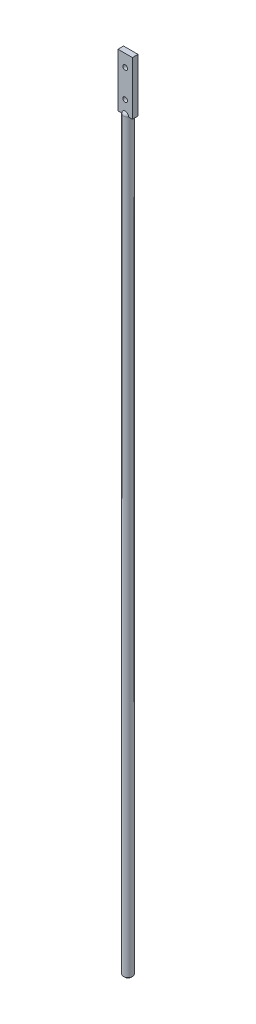
ISO-10303-21;
HEADER;
FILE_DESCRIPTION(('STEP AP214'),'2;1');
FILE_NAME('part.step','',(''),(''),'','','');
FILE_SCHEMA(('AUTOMOTIVE_DESIGN { 1 0 10303 214 1 1 1 1 }'));
ENDSEC;
DATA;
#1=APPLICATION_CONTEXT('core data for automotive mechanical design processes');
#2=APPLICATION_PROTOCOL_DEFINITION('international standard','automotive_design',2000,#1);
#3=PRODUCT_CONTEXT('',#1,'mechanical');
#4=PRODUCT('Part','Part','',(#3));
#5=PRODUCT_RELATED_PRODUCT_CATEGORY('part','',(#4));
#6=PRODUCT_DEFINITION_FORMATION('','',#4);
#7=PRODUCT_DEFINITION_CONTEXT('part definition',#1,'design');
#8=PRODUCT_DEFINITION('design','',#6,#7);
#9=PRODUCT_DEFINITION_SHAPE('','',#8);
#10=(LENGTH_UNIT() NAMED_UNIT(*) SI_UNIT(.MILLI.,.METRE.));
#11=(NAMED_UNIT(*) PLANE_ANGLE_UNIT() SI_UNIT($,.RADIAN.));
#12=(NAMED_UNIT(*) SI_UNIT($,.STERADIAN.) SOLID_ANGLE_UNIT());
#13=UNCERTAINTY_MEASURE_WITH_UNIT(LENGTH_MEASURE(1.E-05),#10,'distance_accuracy_value','');
#14=(GEOMETRIC_REPRESENTATION_CONTEXT(3) GLOBAL_UNCERTAINTY_ASSIGNED_CONTEXT((#13)) GLOBAL_UNIT_ASSIGNED_CONTEXT((#10,
#11,#12)) REPRESENTATION_CONTEXT('',''));
#15=CARTESIAN_POINT('',(0.,0.,0.));
#16=DIRECTION('',(0.,0.,1.));
#17=DIRECTION('',(1.,0.,0.));
#18=AXIS2_PLACEMENT_3D('',#15,#16,#17);
#19=CARTESIAN_POINT('',(0.,13.,-2.5));
#20=DIRECTION('',(0.,0.,-1.));
#21=DIRECTION('',(1.,0.,0.));
#22=AXIS2_PLACEMENT_3D('',#19,#20,#21);
#23=CYLINDRICAL_SURFACE('',#22,2.1);
#24=CARTESIAN_POINT('',(0.,13.,2.5));
#25=DIRECTION('',(0.,0.,1.));
#26=DIRECTION('',(1.,0.,0.));
#27=AXIS2_PLACEMENT_3D('',#24,#25,#26);
#28=CIRCLE('',#27,2.1);
#29=CARTESIAN_POINT('',(2.1,13.,2.5));
#30=VERTEX_POINT('',#29);
#31=EDGE_CURVE('E44',#30,#30,#28,.F.);
#32=ORIENTED_EDGE('',*,*,#31,.F.);
#33=EDGE_LOOP('',(#32));
#34=FACE_BOUND('',#33,.T.);
#35=CARTESIAN_POINT('',(0.,13.,-2.5));
#36=DIRECTION('',(0.,0.,1.));
#37=DIRECTION('',(1.,0.,0.));
#38=AXIS2_PLACEMENT_3D('',#35,#36,#37);
#39=CIRCLE('',#38,2.1);
#40=CARTESIAN_POINT('',(2.1,13.,-2.5));
#41=VERTEX_POINT('',#40);
#42=EDGE_CURVE('E165',#41,#41,#39,.F.);
#43=ORIENTED_EDGE('',*,*,#42,.T.);
#44=EDGE_LOOP('',(#43));
#45=FACE_BOUND('',#44,.T.);
#46=ADVANCED_FACE('F40',(#34,#45),#23,.F.);
#47=CARTESIAN_POINT('',(0.,-12.,-2.5));
#48=DIRECTION('',(0.,0.,-1.));
#49=DIRECTION('',(1.,0.,0.));
#50=AXIS2_PLACEMENT_3D('',#47,#48,#49);
#51=CYLINDRICAL_SURFACE('',#50,2.1);
#52=CARTESIAN_POINT('',(0.,-12.,2.5));
#53=DIRECTION('',(0.,0.,1.));
#54=DIRECTION('',(1.,0.,0.));
#55=AXIS2_PLACEMENT_3D('',#52,#53,#54);
#56=CIRCLE('',#55,2.1);
#57=CARTESIAN_POINT('',(2.1,-12.,2.5));
#58=VERTEX_POINT('',#57);
#59=EDGE_CURVE('E167',#58,#58,#56,.F.);
#60=ORIENTED_EDGE('',*,*,#59,.F.);
#61=EDGE_LOOP('',(#60));
#62=FACE_BOUND('',#61,.T.);
#63=CARTESIAN_POINT('',(0.,-12.,-2.5));
#64=DIRECTION('',(0.,0.,1.));
#65=DIRECTION('',(1.,0.,0.));
#66=AXIS2_PLACEMENT_3D('',#63,#64,#65);
#67=CIRCLE('',#66,2.1);
#68=CARTESIAN_POINT('',(2.1,-12.,-2.5));
#69=VERTEX_POINT('',#68);
#70=EDGE_CURVE('E137',#69,#69,#67,.F.);
#71=ORIENTED_EDGE('',*,*,#70,.T.);
#72=EDGE_LOOP('',(#71));
#73=FACE_BOUND('',#72,.T.);
#74=ADVANCED_FACE('F177',(#62,#73),#51,.F.);
#75=CARTESIAN_POINT('',(-6.50000000000001,24.,-2.5));
#76=DIRECTION('',(0.,1.,0.));
#77=DIRECTION('',(0.,0.,-1.));
#78=AXIS2_PLACEMENT_3D('',#75,#76,#77);
#79=PLANE('',#78);
#80=DIRECTION('',(1.,0.,0.));
#81=VECTOR('',#80,1.);
#82=CARTESIAN_POINT('',(0.,24.,2.5));
#83=LINE('',#82,#81);
#84=CARTESIAN_POINT('',(6.5,24.,2.5));
#85=VERTEX_POINT('',#84);
#86=CARTESIAN_POINT('',(-6.50000000000001,24.,2.5));
#87=VERTEX_POINT('',#86);
#88=EDGE_CURVE('E120',#85,#87,#83,.F.);
#89=ORIENTED_EDGE('',*,*,#88,.F.);
#90=DIRECTION('',(0.,0.,-1.));
#91=VECTOR('',#90,1.);
#92=CARTESIAN_POINT('',(6.5,24.,-2.5));
#93=LINE('',#92,#91);
#94=CARTESIAN_POINT('',(6.5,24.,-2.5));
#95=VERTEX_POINT('',#94);
#96=EDGE_CURVE('E121',#85,#95,#93,.T.);
#97=ORIENTED_EDGE('',*,*,#96,.T.);
#98=DIRECTION('',(1.,0.,0.));
#99=VECTOR('',#98,1.);
#100=CARTESIAN_POINT('',(0.,24.,-2.5));
#101=LINE('',#100,#99);
#102=CARTESIAN_POINT('',(-6.50000000000001,24.,-2.5));
#103=VERTEX_POINT('',#102);
#104=EDGE_CURVE('E105',#95,#103,#101,.F.);
#105=ORIENTED_EDGE('',*,*,#104,.T.);
#106=DIRECTION('',(0.,0.,-1.));
#107=VECTOR('',#106,1.);
#108=CARTESIAN_POINT('',(-6.50000000000001,24.,-2.5));
#109=LINE('',#108,#107);
#110=EDGE_CURVE('E147',#87,#103,#109,.T.);
#111=ORIENTED_EDGE('',*,*,#110,.F.);
#112=EDGE_LOOP('',(#89,#97,#105,#111));
#113=FACE_BOUND('',#112,.T.);
#114=ADVANCED_FACE('F207',(#113),#79,.T.);
#115=CARTESIAN_POINT('',(-6.50000000000001,24.,-2.5));
#116=DIRECTION('',(1.,0.,0.));
#117=DIRECTION('',(0.,1.,0.));
#118=AXIS2_PLACEMENT_3D('',#115,#116,#117);
#119=PLANE('',#118);
#120=DIRECTION('',(0.,1.,0.));
#121=VECTOR('',#120,1.);
#122=CARTESIAN_POINT('',(-6.50000000000001,0.,-2.5));
#123=LINE('',#122,#121);
#124=CARTESIAN_POINT('',(-6.5,-24.,-2.5));
#125=VERTEX_POINT('',#124);
#126=EDGE_CURVE('E132',#103,#125,#123,.F.);
#127=ORIENTED_EDGE('',*,*,#126,.T.);
#128=DIRECTION('',(0.,0.,-1.));
#129=VECTOR('',#128,1.);
#130=CARTESIAN_POINT('',(-6.5,-24.,-2.5));
#131=LINE('',#130,#129);
#132=CARTESIAN_POINT('',(-6.5,-24.,2.5));
#133=VERTEX_POINT('',#132);
#134=EDGE_CURVE('E104',#133,#125,#131,.T.);
#135=ORIENTED_EDGE('',*,*,#134,.F.);
#136=DIRECTION('',(0.,1.,0.));
#137=VECTOR('',#136,1.);
#138=CARTESIAN_POINT('',(-6.50000000000001,0.,2.5));
#139=LINE('',#138,#137);
#140=EDGE_CURVE('E102',#87,#133,#139,.F.);
#141=ORIENTED_EDGE('',*,*,#140,.F.);
#142=ORIENTED_EDGE('',*,*,#110,.T.);
#143=EDGE_LOOP('',(#127,#135,#141,#142));
#144=FACE_BOUND('',#143,.T.);
#145=ADVANCED_FACE('F203',(#144),#119,.F.);
#146=CARTESIAN_POINT('',(0.,-694.5,0.));
#147=DIRECTION('',(0.,-1.,0.));
#148=DIRECTION('',(0.,0.,1.));
#149=AXIS2_PLACEMENT_3D('',#146,#147,#148);
#150=PLANE('',#149);
#151=CARTESIAN_POINT('',(0.,-694.500000000005,0.));
#152=DIRECTION('',(0.,-1.,0.));
#153=DIRECTION('',(0.,0.,-1.));
#154=AXIS2_PLACEMENT_3D('',#151,#152,#153);
#155=CIRCLE('',#154,2.9999999999859);
#156=CARTESIAN_POINT('',(0.,-694.500000000005,-2.9999999999859));
#157=VERTEX_POINT('',#156);
#158=EDGE_CURVE('E97',#157,#157,#155,.T.);
#159=ORIENTED_EDGE('',*,*,#158,.T.);
#160=EDGE_LOOP('',(#159));
#161=FACE_BOUND('',#160,.T.);
#162=ADVANCED_FACE('F199',(#161),#150,.T.);
#163=CARTESIAN_POINT('',(6.5,24.,-2.5));
#164=DIRECTION('',(1.,0.,0.));
#165=DIRECTION('',(0.,1.,0.));
#166=AXIS2_PLACEMENT_3D('',#163,#164,#165);
#167=PLANE('',#166);
#168=DIRECTION('',(0.,1.,0.));
#169=VECTOR('',#168,1.);
#170=CARTESIAN_POINT('',(6.5,0.,2.5));
#171=LINE('',#170,#169);
#172=CARTESIAN_POINT('',(6.5,-24.,2.5));
#173=VERTEX_POINT('',#172);
#174=EDGE_CURVE('E117',#173,#85,#171,.T.);
#175=ORIENTED_EDGE('',*,*,#174,.F.);
#176=DIRECTION('',(0.,0.,-1.));
#177=VECTOR('',#176,1.);
#178=CARTESIAN_POINT('',(6.5,-24.,-2.5));
#179=LINE('',#178,#177);
#180=CARTESIAN_POINT('',(6.5,-24.,-2.5));
#181=VERTEX_POINT('',#180);
#182=EDGE_CURVE('E124',#181,#173,#179,.F.);
#183=ORIENTED_EDGE('',*,*,#182,.F.);
#184=DIRECTION('',(0.,1.,0.));
#185=VECTOR('',#184,1.);
#186=CARTESIAN_POINT('',(6.5,0.,-2.5));
#187=LINE('',#186,#185);
#188=EDGE_CURVE('E109',#181,#95,#187,.T.);
#189=ORIENTED_EDGE('',*,*,#188,.T.);
#190=ORIENTED_EDGE('',*,*,#96,.F.);
#191=EDGE_LOOP('',(#175,#183,#189,#190));
#192=FACE_BOUND('',#191,.T.);
#193=ADVANCED_FACE('F191',(#192),#167,.T.);
#194=CARTESIAN_POINT('',(0.,0.,2.5));
#195=DIRECTION('',(0.,0.,-1.));
#196=DIRECTION('',(1.,0.,0.));
#197=AXIS2_PLACEMENT_3D('',#194,#195,#196);
#198=PLANE('',#197);
#199=ORIENTED_EDGE('',*,*,#59,.T.);
#200=EDGE_LOOP('',(#199));
#201=FACE_BOUND('',#200,.T.);
#202=ORIENTED_EDGE('',*,*,#31,.T.);
#203=EDGE_LOOP('',(#202));
#204=FACE_BOUND('',#203,.T.);
#205=DIRECTION('',(1.,0.,0.));
#206=VECTOR('',#205,1.);
#207=CARTESIAN_POINT('',(-6.5,-24.,2.5));
#208=LINE('',#207,#206);
#209=CARTESIAN_POINT('',(-3.1224989991992,-24.,2.5));
#210=VERTEX_POINT('',#209);
#211=EDGE_CURVE('E84',#210,#133,#208,.F.);
#212=ORIENTED_EDGE('',*,*,#211,.F.);
#213=CARTESIAN_POINT('',(0.,-24.,2.5));
#214=DIRECTION('',(0.,0.,1.));
#215=DIRECTION('',(1.,0.,0.));
#216=AXIS2_PLACEMENT_3D('',#213,#214,#215);
#217=CIRCLE('',#216,3.1224989991992);
#218=CARTESIAN_POINT('',(3.1224989991992,-24.,2.5));
#219=VERTEX_POINT('',#218);
#220=EDGE_CURVE('E92',#210,#219,#217,.F.);
#221=ORIENTED_EDGE('',*,*,#220,.T.);
#222=DIRECTION('',(1.,0.,0.));
#223=VECTOR('',#222,1.);
#224=CARTESIAN_POINT('',(-6.5,-24.,2.5));
#225=LINE('',#224,#223);
#226=EDGE_CURVE('E127',#173,#219,#225,.F.);
#227=ORIENTED_EDGE('',*,*,#226,.F.);
#228=ORIENTED_EDGE('',*,*,#174,.T.);
#229=ORIENTED_EDGE('',*,*,#88,.T.);
#230=ORIENTED_EDGE('',*,*,#140,.T.);
#231=EDGE_LOOP('',(#212,#221,#227,#228,#229,#230));
#232=FACE_BOUND('',#231,.T.);
#233=ADVANCED_FACE('F99',(#201,#204,#232),#198,.F.);
#234=CARTESIAN_POINT('',(0.,0.,-2.5));
#235=DIRECTION('',(0.,0.,-1.));
#236=DIRECTION('',(1.,0.,0.));
#237=AXIS2_PLACEMENT_3D('',#234,#235,#236);
#238=PLANE('',#237);
#239=ORIENTED_EDGE('',*,*,#188,.F.);
#240=DIRECTION('',(1.,0.,0.));
#241=VECTOR('',#240,1.);
#242=CARTESIAN_POINT('',(-6.5,-24.,-2.5));
#243=LINE('',#242,#241);
#244=CARTESIAN_POINT('',(3.1224989991992,-24.,-2.5));
#245=VERTEX_POINT('',#244);
#246=EDGE_CURVE('E96',#245,#181,#243,.T.);
#247=ORIENTED_EDGE('',*,*,#246,.F.);
#248=CARTESIAN_POINT('',(0.,-24.,-2.5));
#249=DIRECTION('',(0.,0.,1.));
#250=DIRECTION('',(1.,0.,0.));
#251=AXIS2_PLACEMENT_3D('',#248,#249,#250);
#252=CIRCLE('',#251,3.1224989991992);
#253=CARTESIAN_POINT('',(-3.1224989991992,-24.,-2.5));
#254=VERTEX_POINT('',#253);
#255=EDGE_CURVE('E89',#245,#254,#252,.T.);
#256=ORIENTED_EDGE('',*,*,#255,.T.);
#257=DIRECTION('',(1.,0.,0.));
#258=VECTOR('',#257,1.);
#259=CARTESIAN_POINT('',(-6.5,-24.,-2.5));
#260=LINE('',#259,#258);
#261=EDGE_CURVE('E87',#125,#254,#260,.T.);
#262=ORIENTED_EDGE('',*,*,#261,.F.);
#263=ORIENTED_EDGE('',*,*,#126,.F.);
#264=ORIENTED_EDGE('',*,*,#104,.F.);
#265=EDGE_LOOP('',(#239,#247,#256,#262,#263,#264));
#266=FACE_BOUND('',#265,.T.);
#267=ORIENTED_EDGE('',*,*,#70,.F.);
#268=EDGE_LOOP('',(#267));
#269=FACE_BOUND('',#268,.T.);
#270=ORIENTED_EDGE('',*,*,#42,.F.);
#271=EDGE_LOOP('',(#270));
#272=FACE_BOUND('',#271,.T.);
#273=ADVANCED_FACE('F181',(#266,#269,#272),#238,.T.);
#274=CARTESIAN_POINT('',(-6.5,-24.,-2.5));
#275=DIRECTION('',(0.,1.,0.));
#276=DIRECTION('',(0.,0.,-1.));
#277=AXIS2_PLACEMENT_3D('',#274,#275,#276);
#278=PLANE('',#277);
#279=ORIENTED_EDGE('',*,*,#261,.T.);
#280=CARTESIAN_POINT('',(0.,-24.,0.));
#281=DIRECTION('',(0.,-1.,0.));
#282=DIRECTION('',(0.,0.,-1.));
#283=AXIS2_PLACEMENT_3D('',#280,#281,#282);
#284=CIRCLE('',#283,4.);
#285=EDGE_CURVE('E71',#254,#210,#284,.F.);
#286=ORIENTED_EDGE('',*,*,#285,.T.);
#287=ORIENTED_EDGE('',*,*,#211,.T.);
#288=ORIENTED_EDGE('',*,*,#134,.T.);
#289=EDGE_LOOP('',(#279,#286,#287,#288));
#290=FACE_BOUND('',#289,.T.);
#291=ADVANCED_FACE('F80',(#290),#278,.F.);
#292=CARTESIAN_POINT('',(0.,-693.500000000142,0.));
#293=DIRECTION('',(0.,1.,0.));
#294=DIRECTION('',(0.,0.,-1.));
#295=AXIS2_PLACEMENT_3D('',#292,#293,#294);
#296=CONICAL_SURFACE('',#295,3.99999999984857,0.785398163397448);
#297=CARTESIAN_POINT('',(0.,-693.5,0.));
#298=DIRECTION('',(0.,-1.,0.));
#299=DIRECTION('',(0.,0.,-1.));
#300=AXIS2_PLACEMENT_3D('',#297,#298,#299);
#301=CIRCLE('',#300,4.);
#302=CARTESIAN_POINT('',(0.,-693.5,-4.));
#303=VERTEX_POINT('',#302);
#304=EDGE_CURVE('E76',#303,#303,#301,.T.);
#305=ORIENTED_EDGE('',*,*,#304,.T.);
#306=EDGE_LOOP('',(#305));
#307=FACE_BOUND('',#306,.T.);
#308=ORIENTED_EDGE('',*,*,#158,.F.);
#309=EDGE_LOOP('',(#308));
#310=FACE_BOUND('',#309,.T.);
#311=ADVANCED_FACE('F189',(#307,#310),#296,.T.);
#312=CARTESIAN_POINT('',(0.,-24.,0.));
#313=DIRECTION('',(1.,0.,0.));
#314=DIRECTION('',(0.,0.,1.));
#315=AXIS2_PLACEMENT_3D('',#312,#313,#314);
#316=SPHERICAL_SURFACE('',#315,4.);
#317=ORIENTED_EDGE('',*,*,#220,.F.);
#318=CARTESIAN_POINT('',(0.,-24.,0.));
#319=DIRECTION('',(0.,-1.,0.));
#320=DIRECTION('',(0.,0.,-1.));
#321=AXIS2_PLACEMENT_3D('',#318,#319,#320);
#322=CIRCLE('',#321,4.);
#323=EDGE_CURVE('E67',#210,#219,#322,.F.);
#324=ORIENTED_EDGE('',*,*,#323,.T.);
#325=EDGE_LOOP('',(#317,#324));
#326=FACE_BOUND('',#325,.T.);
#327=ADVANCED_FACE('F93',(#326),#316,.T.);
#328=CARTESIAN_POINT('',(-6.5,-24.,-2.5));
#329=DIRECTION('',(0.,1.,0.));
#330=DIRECTION('',(0.,0.,-1.));
#331=AXIS2_PLACEMENT_3D('',#328,#329,#330);
#332=PLANE('',#331);
#333=ORIENTED_EDGE('',*,*,#226,.T.);
#334=CARTESIAN_POINT('',(0.,-24.,0.));
#335=DIRECTION('',(0.,-1.,0.));
#336=DIRECTION('',(0.,0.,-1.));
#337=AXIS2_PLACEMENT_3D('',#334,#335,#336);
#338=CIRCLE('',#337,4.);
#339=EDGE_CURVE('E50',#219,#245,#338,.F.);
#340=ORIENTED_EDGE('',*,*,#339,.T.);
#341=ORIENTED_EDGE('',*,*,#246,.T.);
#342=ORIENTED_EDGE('',*,*,#182,.T.);
#343=EDGE_LOOP('',(#333,#340,#341,#342));
#344=FACE_BOUND('',#343,.T.);
#345=ADVANCED_FACE('F215',(#344),#332,.F.);
#346=CARTESIAN_POINT('',(0.,-24.,0.));
#347=DIRECTION('',(1.,0.,0.));
#348=DIRECTION('',(0.,0.785891834052638,-0.618363990841463));
#349=AXIS2_PLACEMENT_3D('',#346,#347,#348);
#350=SPHERICAL_SURFACE('',#349,4.);
#351=ORIENTED_EDGE('',*,*,#255,.F.);
#352=CARTESIAN_POINT('',(0.,-24.,0.));
#353=DIRECTION('',(0.,-1.,0.));
#354=DIRECTION('',(0.,0.,-1.));
#355=AXIS2_PLACEMENT_3D('',#352,#353,#354);
#356=CIRCLE('',#355,4.);
#357=EDGE_CURVE('E11',#245,#254,#356,.F.);
#358=ORIENTED_EDGE('',*,*,#357,.T.);
#359=EDGE_LOOP('',(#351,#358));
#360=FACE_BOUND('',#359,.T.);
#361=ADVANCED_FACE('F42',(#360),#350,.T.);
#362=CARTESIAN_POINT('',(0.,-694.5,0.));
#363=DIRECTION('',(0.,1.,0.));
#364=DIRECTION('',(0.,0.,-1.));
#365=AXIS2_PLACEMENT_3D('',#362,#363,#364);
#366=CYLINDRICAL_SURFACE('',#365,4.);
#367=ORIENTED_EDGE('',*,*,#285,.F.);
#368=ORIENTED_EDGE('',*,*,#357,.F.);
#369=ORIENTED_EDGE('',*,*,#339,.F.);
#370=ORIENTED_EDGE('',*,*,#323,.F.);
#371=EDGE_LOOP('',(#367,#368,#369,#370));
#372=FACE_BOUND('',#371,.T.);
#373=ORIENTED_EDGE('',*,*,#304,.F.);
#374=EDGE_LOOP('',(#373));
#375=FACE_BOUND('',#374,.T.);
#376=ADVANCED_FACE('F69',(#372,#375),#366,.T.);
#377=CLOSED_SHELL('',(#46,#74,#114,#145,#162,#193,#233,#273,#291,#311,#327,#345,#361,#376));
#378=MANIFOLD_SOLID_BREP('B2',#377);
#379=ADVANCED_BREP_SHAPE_REPRESENTATION('',(#18,#378),#14);
#380=SHAPE_DEFINITION_REPRESENTATION(#9,#379);
ENDSEC;
END-ISO-10303-21;
